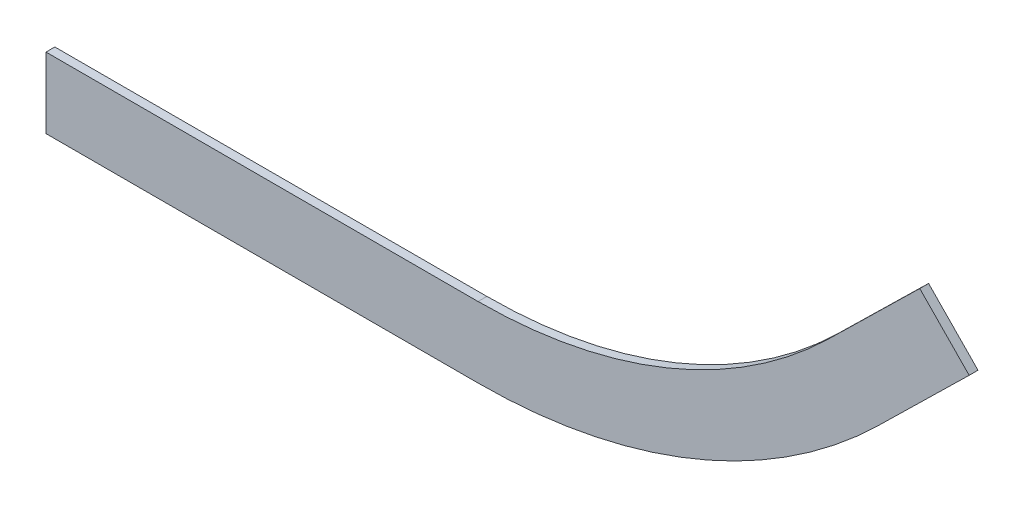
ISO-10303-21;
HEADER;
FILE_DESCRIPTION(('STEP AP214'),'2;1');
FILE_NAME('part.step','',(''),(''),'','','');
FILE_SCHEMA(('AUTOMOTIVE_DESIGN { 1 0 10303 214 1 1 1 1 }'));
ENDSEC;
DATA;
#1=APPLICATION_CONTEXT('core data for automotive mechanical design processes');
#2=APPLICATION_PROTOCOL_DEFINITION('international standard','automotive_design',2000,#1);
#3=PRODUCT_CONTEXT('',#1,'mechanical');
#4=PRODUCT('Part','Part','',(#3));
#5=PRODUCT_RELATED_PRODUCT_CATEGORY('part','',(#4));
#6=PRODUCT_DEFINITION_FORMATION('','',#4);
#7=PRODUCT_DEFINITION_CONTEXT('part definition',#1,'design');
#8=PRODUCT_DEFINITION('design','',#6,#7);
#9=PRODUCT_DEFINITION_SHAPE('','',#8);
#10=(LENGTH_UNIT() NAMED_UNIT(*) SI_UNIT(.MILLI.,.METRE.));
#11=(NAMED_UNIT(*) PLANE_ANGLE_UNIT() SI_UNIT($,.RADIAN.));
#12=(NAMED_UNIT(*) SI_UNIT($,.STERADIAN.) SOLID_ANGLE_UNIT());
#13=UNCERTAINTY_MEASURE_WITH_UNIT(LENGTH_MEASURE(1.E-05),#10,'distance_accuracy_value','');
#14=(GEOMETRIC_REPRESENTATION_CONTEXT(3) GLOBAL_UNCERTAINTY_ASSIGNED_CONTEXT((#13)) GLOBAL_UNIT_ASSIGNED_CONTEXT((#10,
#11,#12)) REPRESENTATION_CONTEXT('',''));
#15=CARTESIAN_POINT('',(0.,0.,0.));
#16=DIRECTION('',(0.,0.,1.));
#17=DIRECTION('',(1.,0.,0.));
#18=AXIS2_PLACEMENT_3D('',#15,#16,#17);
#19=CARTESIAN_POINT('',(494.796861894852,171.441265278339,2.5));
#20=DIRECTION('',(0.714607456033303,0.699525684861972,0.));
#21=DIRECTION('',(-0.699525684861972,0.714607456033303,0.));
#22=AXIS2_PLACEMENT_3D('',#19,#20,#21);
#23=PLANE('',#22);
#24=DIRECTION('',(-0.699525684861972,0.714607456033303,0.));
#25=VECTOR('',#24,1.);
#26=CARTESIAN_POINT('',(494.796861894852,171.441265278339,-2.5));
#27=LINE('',#26,#25);
#28=CARTESIAN_POINT('',(522.777889287821,142.85696703855,-2.5));
#29=VERTEX_POINT('',#28);
#30=CARTESIAN_POINT('',(494.796861894852,171.441265278339,-2.5));
#31=VERTEX_POINT('',#30);
#32=EDGE_CURVE('E142',#29,#31,#27,.T.);
#33=ORIENTED_EDGE('',*,*,#32,.T.);
#34=DIRECTION('',(0.,0.,-1.));
#35=VECTOR('',#34,1.);
#36=CARTESIAN_POINT('',(494.796861894852,171.441265278339,2.5));
#37=LINE('',#36,#35);
#38=CARTESIAN_POINT('',(494.796861894852,171.441265278339,2.5));
#39=VERTEX_POINT('',#38);
#40=EDGE_CURVE('E11',#39,#31,#37,.T.);
#41=ORIENTED_EDGE('',*,*,#40,.F.);
#42=DIRECTION('',(-0.699525684861972,0.714607456033303,0.));
#43=VECTOR('',#42,1.);
#44=CARTESIAN_POINT('',(494.796861894852,171.441265278339,2.5));
#45=LINE('',#44,#43);
#46=CARTESIAN_POINT('',(522.777889287821,142.85696703855,2.5));
#47=VERTEX_POINT('',#46);
#48=EDGE_CURVE('E126',#47,#39,#45,.T.);
#49=ORIENTED_EDGE('',*,*,#48,.F.);
#50=DIRECTION('',(0.,0.,-1.));
#51=VECTOR('',#50,1.);
#52=CARTESIAN_POINT('',(522.777889287821,142.85696703855,2.5));
#53=LINE('',#52,#51);
#54=EDGE_CURVE('E45',#47,#29,#53,.T.);
#55=ORIENTED_EDGE('',*,*,#54,.T.);
#56=EDGE_LOOP('',(#33,#41,#49,#55));
#57=FACE_BOUND('',#56,.T.);
#58=ADVANCED_FACE('F35',(#57),#23,.T.);
#59=CARTESIAN_POINT('',(487.047516486156,107.880682795451,2.5));
#60=DIRECTION('',(0.69952568486197,-0.714607456033304,0.));
#61=DIRECTION('',(0.714607456033304,0.69952568486197,0.));
#62=AXIS2_PLACEMENT_3D('',#59,#60,#61);
#63=PLANE('',#62);
#64=DIRECTION('',(0.714607456033304,0.69952568486197,0.));
#65=VECTOR('',#64,1.);
#66=CARTESIAN_POINT('',(487.047516486156,107.880682795451,-2.5));
#67=LINE('',#66,#65);
#68=CARTESIAN_POINT('',(471.305428265923,92.4708309163476,-2.5));
#69=VERTEX_POINT('',#68);
#70=EDGE_CURVE('E83',#69,#29,#67,.T.);
#71=ORIENTED_EDGE('',*,*,#70,.T.);
#72=ORIENTED_EDGE('',*,*,#54,.F.);
#73=DIRECTION('',(0.714607456033303,0.699525684861972,0.));
#74=VECTOR('',#73,1.);
#75=CARTESIAN_POINT('',(471.305428261894,92.4708309204644,2.5));
#76=LINE('',#75,#74);
#77=CARTESIAN_POINT('',(471.305428265923,92.4708309163476,2.5));
#78=VERTEX_POINT('',#77);
#79=EDGE_CURVE('E111',#78,#47,#76,.T.);
#80=ORIENTED_EDGE('',*,*,#79,.F.);
#81=DIRECTION('',(0.,0.,-1.));
#82=VECTOR('',#81,1.);
#83=CARTESIAN_POINT('',(471.305428265923,92.4708309163476,2.5));
#84=LINE('',#83,#82);
#85=EDGE_CURVE('E118',#78,#69,#84,.T.);
#86=ORIENTED_EDGE('',*,*,#85,.T.);
#87=EDGE_LOOP('',(#71,#72,#80,#86));
#88=FACE_BOUND('',#87,.T.);
#89=ADVANCED_FACE('F124',(#88),#63,.T.);
#90=CARTESIAN_POINT('',(244.650168028876,324.012777723523,2.5));
#91=DIRECTION('',(0.,0.,-1.));
#92=DIRECTION('',(1.,0.,0.));
#93=AXIS2_PLACEMENT_3D('',#90,#91,#92);
#94=CYLINDRICAL_SURFACE('',#93,324.012777717764);
#95=CARTESIAN_POINT('',(244.650168028876,324.012777723523,-2.5));
#96=DIRECTION('',(0.,0.,1.));
#97=DIRECTION('',(1.,0.,0.));
#98=AXIS2_PLACEMENT_3D('',#95,#96,#97);
#99=CIRCLE('',#98,324.012777717764);
#100=CARTESIAN_POINT('',(244.650168028876,-9.43689570931383E-13,-2.5));
#101=VERTEX_POINT('',#100);
#102=EDGE_CURVE('E121',#101,#69,#99,.T.);
#103=ORIENTED_EDGE('',*,*,#102,.T.);
#104=ORIENTED_EDGE('',*,*,#85,.F.);
#105=CARTESIAN_POINT('',(244.650168028876,324.012777723523,2.5));
#106=DIRECTION('',(0.,0.,1.));
#107=DIRECTION('',(1.,0.,0.));
#108=AXIS2_PLACEMENT_3D('',#105,#106,#107);
#109=CIRCLE('',#108,324.012777717764);
#110=CARTESIAN_POINT('',(244.650168028876,-9.43689570931383E-13,2.5));
#111=VERTEX_POINT('',#110);
#112=EDGE_CURVE('E107',#111,#78,#109,.T.);
#113=ORIENTED_EDGE('',*,*,#112,.F.);
#114=DIRECTION('',(0.,0.,-1.));
#115=VECTOR('',#114,1.);
#116=CARTESIAN_POINT('',(244.650168028876,-9.43689570931383E-13,2.5));
#117=LINE('',#116,#115);
#118=EDGE_CURVE('E122',#111,#101,#117,.T.);
#119=ORIENTED_EDGE('',*,*,#118,.T.);
#120=EDGE_LOOP('',(#103,#104,#113,#119));
#121=FACE_BOUND('',#120,.T.);
#122=ADVANCED_FACE('F119',(#121),#94,.T.);
#123=CARTESIAN_POINT('',(50.,-9.43689570931383E-13,2.5));
#124=DIRECTION('',(0.,-1.,0.));
#125=DIRECTION('',(0.,0.,1.));
#126=AXIS2_PLACEMENT_3D('',#123,#124,#125);
#127=PLANE('',#126);
#128=DIRECTION('',(1.,0.,0.));
#129=VECTOR('',#128,1.);
#130=CARTESIAN_POINT('',(50.,-9.43689570931383E-13,-2.5));
#131=LINE('',#130,#129);
#132=CARTESIAN_POINT('',(0.,0.,-2.5));
#133=VERTEX_POINT('',#132);
#134=EDGE_CURVE('E138',#133,#101,#131,.T.);
#135=ORIENTED_EDGE('',*,*,#134,.T.);
#136=ORIENTED_EDGE('',*,*,#118,.F.);
#137=DIRECTION('',(1.,0.,0.));
#138=VECTOR('',#137,1.);
#139=CARTESIAN_POINT('',(0.,0.,2.5));
#140=LINE('',#139,#138);
#141=CARTESIAN_POINT('',(0.,0.,2.5));
#142=VERTEX_POINT('',#141);
#143=EDGE_CURVE('E113',#142,#111,#140,.T.);
#144=ORIENTED_EDGE('',*,*,#143,.F.);
#145=DIRECTION('',(0.,0.,-1.));
#146=VECTOR('',#145,1.);
#147=CARTESIAN_POINT('',(0.,0.,2.5));
#148=LINE('',#147,#146);
#149=EDGE_CURVE('E147',#142,#133,#148,.T.);
#150=ORIENTED_EDGE('',*,*,#149,.T.);
#151=EDGE_LOOP('',(#135,#136,#144,#150));
#152=FACE_BOUND('',#151,.T.);
#153=ADVANCED_FACE('F179',(#152),#127,.T.);
#154=CARTESIAN_POINT('',(6.10622663543836E-13,39.9999999999999,2.5));
#155=DIRECTION('',(-1.,0.,0.));
#156=DIRECTION('',(0.,-1.,0.));
#157=AXIS2_PLACEMENT_3D('',#154,#155,#156);
#158=PLANE('',#157);
#159=DIRECTION('',(0.,-1.,0.));
#160=VECTOR('',#159,1.);
#161=CARTESIAN_POINT('',(6.10622663543836E-13,39.9999999999999,-2.5));
#162=LINE('',#161,#160);
#163=CARTESIAN_POINT('',(6.10622663543836E-13,39.9999999999999,-2.5));
#164=VERTEX_POINT('',#163);
#165=EDGE_CURVE('E136',#164,#133,#162,.T.);
#166=ORIENTED_EDGE('',*,*,#165,.T.);
#167=ORIENTED_EDGE('',*,*,#149,.F.);
#168=DIRECTION('',(0.,-1.,0.));
#169=VECTOR('',#168,1.);
#170=CARTESIAN_POINT('',(6.10622663543836E-13,39.9999999999999,2.5));
#171=LINE('',#170,#169);
#172=CARTESIAN_POINT('',(6.10622663543836E-13,39.9999999999999,2.5));
#173=VERTEX_POINT('',#172);
#174=EDGE_CURVE('E172',#173,#142,#171,.T.);
#175=ORIENTED_EDGE('',*,*,#174,.F.);
#176=DIRECTION('',(0.,0.,-1.));
#177=VECTOR('',#176,1.);
#178=CARTESIAN_POINT('',(6.10622663543836E-13,39.9999999999999,2.5));
#179=LINE('',#178,#177);
#180=EDGE_CURVE('E150',#173,#164,#179,.T.);
#181=ORIENTED_EDGE('',*,*,#180,.T.);
#182=EDGE_LOOP('',(#166,#167,#175,#181));
#183=FACE_BOUND('',#182,.T.);
#184=ADVANCED_FACE('F170',(#183),#158,.T.);
#185=CARTESIAN_POINT('',(6.10622663543836E-13,39.9999999999999,2.5));
#186=DIRECTION('',(0.,1.,0.));
#187=DIRECTION('',(-1.,0.,0.));
#188=AXIS2_PLACEMENT_3D('',#185,#186,#187);
#189=PLANE('',#188);
#190=DIRECTION('',(-1.,0.,0.));
#191=VECTOR('',#190,1.);
#192=CARTESIAN_POINT('',(6.10622663543836E-13,39.9999999999999,-2.5));
#193=LINE('',#192,#191);
#194=CARTESIAN_POINT('',(244.655381072134,39.9999999999964,-2.5));
#195=VERTEX_POINT('',#194);
#196=EDGE_CURVE('E134',#195,#164,#193,.T.);
#197=ORIENTED_EDGE('',*,*,#196,.T.);
#198=ORIENTED_EDGE('',*,*,#180,.F.);
#199=DIRECTION('',(-1.,0.,0.));
#200=VECTOR('',#199,1.);
#201=CARTESIAN_POINT('',(50.0000000000006,39.999999999999,2.5));
#202=LINE('',#201,#200);
#203=CARTESIAN_POINT('',(244.655381072134,39.9999999999964,2.5));
#204=VERTEX_POINT('',#203);
#205=EDGE_CURVE('E173',#204,#173,#202,.T.);
#206=ORIENTED_EDGE('',*,*,#205,.F.);
#207=DIRECTION('',(0.,0.,-1.));
#208=VECTOR('',#207,1.);
#209=CARTESIAN_POINT('',(244.655381072134,39.9999999999964,2.5));
#210=LINE('',#209,#208);
#211=EDGE_CURVE('E152',#204,#195,#210,.T.);
#212=ORIENTED_EDGE('',*,*,#211,.T.);
#213=EDGE_LOOP('',(#197,#198,#206,#212));
#214=FACE_BOUND('',#213,.T.);
#215=ADVANCED_FACE('F167',(#214),#189,.T.);
#216=CARTESIAN_POINT('',(244.655381072137,323.999999999996,2.5));
#217=DIRECTION('',(0.,0.,-1.));
#218=DIRECTION('',(1.,0.,0.));
#219=AXIS2_PLACEMENT_3D('',#216,#217,#218);
#220=CYLINDRICAL_SURFACE('',#219,284.);
#221=CARTESIAN_POINT('',(244.655381072137,323.999999999996,-2.5));
#222=DIRECTION('',(0.,0.,-1.));
#223=DIRECTION('',(1.,0.,0.));
#224=AXIS2_PLACEMENT_3D('',#221,#222,#223);
#225=CIRCLE('',#224,284.);
#226=CARTESIAN_POINT('',(443.320675572937,121.051482486538,-2.5));
#227=VERTEX_POINT('',#226);
#228=EDGE_CURVE('E132',#227,#195,#225,.T.);
#229=ORIENTED_EDGE('',*,*,#228,.T.);
#230=ORIENTED_EDGE('',*,*,#211,.F.);
#231=CARTESIAN_POINT('',(244.655381072137,323.999999999996,2.5));
#232=DIRECTION('',(0.,0.,-1.));
#233=DIRECTION('',(1.,0.,0.));
#234=AXIS2_PLACEMENT_3D('',#231,#232,#233);
#235=CIRCLE('',#234,284.);
#236=CARTESIAN_POINT('',(443.320675572937,121.051482486538,2.5));
#237=VERTEX_POINT('',#236);
#238=EDGE_CURVE('E162',#237,#204,#235,.T.);
#239=ORIENTED_EDGE('',*,*,#238,.F.);
#240=DIRECTION('',(0.,0.,-1.));
#241=VECTOR('',#240,1.);
#242=CARTESIAN_POINT('',(443.320675572937,121.051482486538,2.5));
#243=LINE('',#242,#241);
#244=EDGE_CURVE('E39',#237,#227,#243,.T.);
#245=ORIENTED_EDGE('',*,*,#244,.T.);
#246=EDGE_LOOP('',(#229,#230,#239,#245));
#247=FACE_BOUND('',#246,.T.);
#248=ADVANCED_FACE('F161',(#247),#220,.F.);
#249=CARTESIAN_POINT('',(443.320675572937,121.051482486538,2.5));
#250=DIRECTION('',(-0.699525684861968,0.714607456033307,0.));
#251=DIRECTION('',(-0.714607456033307,-0.699525684861968,0.));
#252=AXIS2_PLACEMENT_3D('',#249,#250,#251);
#253=PLANE('',#252);
#254=DIRECTION('',(-0.714607456033306,-0.699525684861968,0.));
#255=VECTOR('',#254,1.);
#256=CARTESIAN_POINT('',(443.320675572937,121.051482486538,-2.5));
#257=LINE('',#256,#255);
#258=EDGE_CURVE('E90',#31,#227,#257,.T.);
#259=ORIENTED_EDGE('',*,*,#258,.T.);
#260=ORIENTED_EDGE('',*,*,#244,.F.);
#261=DIRECTION('',(-0.714607456033303,-0.699525684861972,0.));
#262=VECTOR('',#261,1.);
#263=CARTESIAN_POINT('',(459.066489093187,136.464981035241,2.5));
#264=LINE('',#263,#262);
#265=EDGE_CURVE('E53',#39,#237,#264,.T.);
#266=ORIENTED_EDGE('',*,*,#265,.F.);
#267=ORIENTED_EDGE('',*,*,#40,.T.);
#268=EDGE_LOOP('',(#259,#260,#266,#267));
#269=FACE_BOUND('',#268,.T.);
#270=ADVANCED_FACE('F37',(#269),#253,.T.);
#271=CARTESIAN_POINT('',(244.650168028876,324.012777723523,2.5));
#272=DIRECTION('',(0.,0.,-1.));
#273=DIRECTION('',(1.,0.,0.));
#274=AXIS2_PLACEMENT_3D('',#271,#272,#273);
#275=PLANE('',#274);
#276=ORIENTED_EDGE('',*,*,#265,.T.);
#277=ORIENTED_EDGE('',*,*,#238,.T.);
#278=ORIENTED_EDGE('',*,*,#205,.T.);
#279=ORIENTED_EDGE('',*,*,#174,.T.);
#280=ORIENTED_EDGE('',*,*,#143,.T.);
#281=ORIENTED_EDGE('',*,*,#112,.T.);
#282=ORIENTED_EDGE('',*,*,#79,.T.);
#283=ORIENTED_EDGE('',*,*,#48,.T.);
#284=EDGE_LOOP('',(#276,#277,#278,#279,#280,#281,#282,#283));
#285=FACE_BOUND('',#284,.T.);
#286=ADVANCED_FACE('F109',(#285),#275,.F.);
#287=CARTESIAN_POINT('',(244.650168028876,324.012777723523,-2.5));
#288=DIRECTION('',(0.,0.,-1.));
#289=DIRECTION('',(1.,0.,0.));
#290=AXIS2_PLACEMENT_3D('',#287,#288,#289);
#291=PLANE('',#290);
#292=ORIENTED_EDGE('',*,*,#32,.F.);
#293=ORIENTED_EDGE('',*,*,#70,.F.);
#294=ORIENTED_EDGE('',*,*,#102,.F.);
#295=ORIENTED_EDGE('',*,*,#134,.F.);
#296=ORIENTED_EDGE('',*,*,#165,.F.);
#297=ORIENTED_EDGE('',*,*,#196,.F.);
#298=ORIENTED_EDGE('',*,*,#228,.F.);
#299=ORIENTED_EDGE('',*,*,#258,.F.);
#300=EDGE_LOOP('',(#292,#293,#294,#295,#296,#297,#298,#299));
#301=FACE_BOUND('',#300,.T.);
#302=ADVANCED_FACE('F163',(#301),#291,.T.);
#303=CLOSED_SHELL('',(#58,#89,#122,#153,#184,#215,#248,#270,#286,#302));
#304=MANIFOLD_SOLID_BREP('B2',#303);
#305=ADVANCED_BREP_SHAPE_REPRESENTATION('',(#18,#304),#14);
#306=SHAPE_DEFINITION_REPRESENTATION(#9,#305);
ENDSEC;
END-ISO-10303-21;
